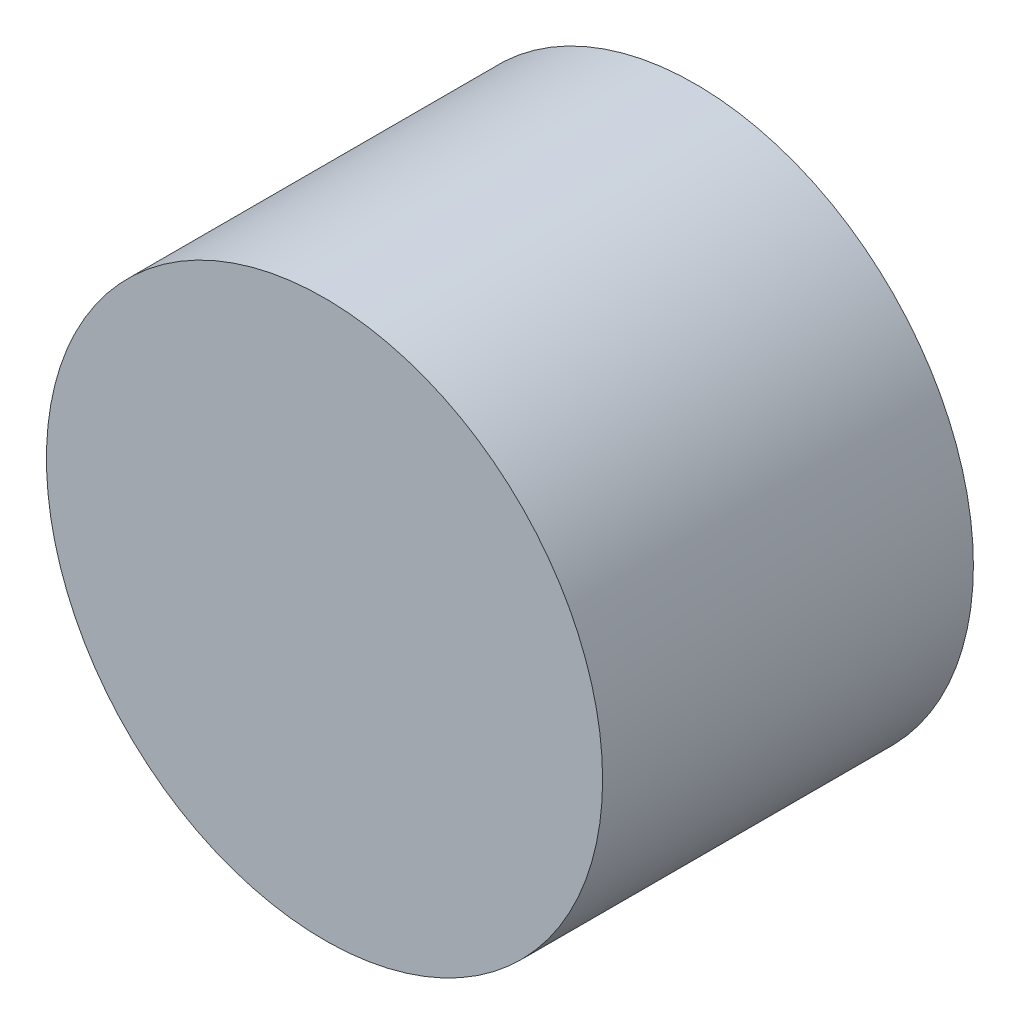
ISO-10303-21;
HEADER;
FILE_DESCRIPTION(('STEP AP214'),'2;1');
FILE_NAME('part.step','',(''),(''),'','','');
FILE_SCHEMA(('AUTOMOTIVE_DESIGN { 1 0 10303 214 1 1 1 1 }'));
ENDSEC;
DATA;
#1=APPLICATION_CONTEXT('core data for automotive mechanical design processes');
#2=APPLICATION_PROTOCOL_DEFINITION('international standard','automotive_design',2000,#1);
#3=PRODUCT_CONTEXT('',#1,'mechanical');
#4=PRODUCT('Part','Part','',(#3));
#5=PRODUCT_RELATED_PRODUCT_CATEGORY('part','',(#4));
#6=PRODUCT_DEFINITION_FORMATION('','',#4);
#7=PRODUCT_DEFINITION_CONTEXT('part definition',#1,'design');
#8=PRODUCT_DEFINITION('design','',#6,#7);
#9=PRODUCT_DEFINITION_SHAPE('','',#8);
#10=(LENGTH_UNIT() NAMED_UNIT(*) SI_UNIT(.MILLI.,.METRE.));
#11=(NAMED_UNIT(*) PLANE_ANGLE_UNIT() SI_UNIT($,.RADIAN.));
#12=(NAMED_UNIT(*) SI_UNIT($,.STERADIAN.) SOLID_ANGLE_UNIT());
#13=UNCERTAINTY_MEASURE_WITH_UNIT(LENGTH_MEASURE(1.E-05),#10,'distance_accuracy_value','');
#14=(GEOMETRIC_REPRESENTATION_CONTEXT(3) GLOBAL_UNCERTAINTY_ASSIGNED_CONTEXT((#13)) GLOBAL_UNIT_ASSIGNED_CONTEXT((#10,
#11,#12)) REPRESENTATION_CONTEXT('',''));
#15=CARTESIAN_POINT('',(0.,0.,0.));
#16=DIRECTION('',(0.,0.,1.));
#17=DIRECTION('',(1.,0.,0.));
#18=AXIS2_PLACEMENT_3D('',#15,#16,#17);
#19=CARTESIAN_POINT('',(0.,0.,16.));
#20=DIRECTION('',(0.,0.,-1.));
#21=DIRECTION('',(-1.,0.,0.));
#22=AXIS2_PLACEMENT_3D('',#19,#20,#21);
#23=CYLINDRICAL_SURFACE('',#22,12.);
#24=CARTESIAN_POINT('',(0.,0.,0.));
#25=DIRECTION('',(0.,0.,1.));
#26=DIRECTION('',(1.,0.,0.));
#27=AXIS2_PLACEMENT_3D('',#24,#25,#26);
#28=CIRCLE('',#27,12.);
#29=CARTESIAN_POINT('',(12.,0.,0.));
#30=VERTEX_POINT('',#29);
#31=EDGE_CURVE('E86',#30,#30,#28,.T.);
#32=ORIENTED_EDGE('',*,*,#31,.T.);
#33=EDGE_LOOP('',(#32));
#34=FACE_BOUND('',#33,.T.);
#35=CARTESIAN_POINT('',(0.,0.,16.));
#36=DIRECTION('',(0.,0.,1.));
#37=DIRECTION('',(1.,0.,0.));
#38=AXIS2_PLACEMENT_3D('',#35,#36,#37);
#39=CIRCLE('',#38,12.);
#40=CARTESIAN_POINT('',(12.,0.,16.));
#41=VERTEX_POINT('',#40);
#42=EDGE_CURVE('E108',#41,#41,#39,.T.);
#43=ORIENTED_EDGE('',*,*,#42,.F.);
#44=EDGE_LOOP('',(#43));
#45=FACE_BOUND('',#44,.T.);
#46=CARTESIAN_POINT('',(0.,0.,7.));
#47=DIRECTION('',(0.,0.,-1.));
#48=DIRECTION('',(-1.,0.,0.));
#49=AXIS2_PLACEMENT_3D('',#46,#47,#48);
#50=CIRCLE('',#49,12.);
#51=CARTESIAN_POINT('',(-10.3923048454133,-6.,7.));
#52=VERTEX_POINT('',#51);
#53=CARTESIAN_POINT('',(-10.3923048454133,6.,7.));
#54=VERTEX_POINT('',#53);
#55=EDGE_CURVE('E11',#52,#54,#50,.T.);
#56=ORIENTED_EDGE('',*,*,#55,.F.);
#57=DIRECTION('',(0.,0.,-1.));
#58=VECTOR('',#57,1.);
#59=CARTESIAN_POINT('',(-10.3923048454133,-6.,16.));
#60=LINE('',#59,#58);
#61=CARTESIAN_POINT('',(-10.3923048454133,-6.,1.));
#62=VERTEX_POINT('',#61);
#63=EDGE_CURVE('E111',#62,#52,#60,.F.);
#64=ORIENTED_EDGE('',*,*,#63,.F.);
#65=CARTESIAN_POINT('',(0.,0.,1.));
#66=DIRECTION('',(0.,0.,1.));
#67=DIRECTION('',(1.,0.,0.));
#68=AXIS2_PLACEMENT_3D('',#65,#66,#67);
#69=CIRCLE('',#68,12.);
#70=CARTESIAN_POINT('',(-10.3923048454133,6.,1.));
#71=VERTEX_POINT('',#70);
#72=EDGE_CURVE('E115',#71,#62,#69,.T.);
#73=ORIENTED_EDGE('',*,*,#72,.F.);
#74=DIRECTION('',(0.,0.,-1.));
#75=VECTOR('',#74,1.);
#76=CARTESIAN_POINT('',(-10.3923048454133,6.,16.));
#77=LINE('',#76,#75);
#78=EDGE_CURVE('E48',#54,#71,#77,.T.);
#79=ORIENTED_EDGE('',*,*,#78,.F.);
#80=EDGE_LOOP('',(#56,#64,#73,#79));
#81=FACE_BOUND('',#80,.T.);
#82=ADVANCED_FACE('F41',(#34,#45,#81),#23,.T.);
#83=CARTESIAN_POINT('',(0.,0.,16.));
#84=DIRECTION('',(0.,0.,1.));
#85=DIRECTION('',(1.,0.,0.));
#86=AXIS2_PLACEMENT_3D('',#83,#84,#85);
#87=PLANE('',#86);
#88=ORIENTED_EDGE('',*,*,#42,.T.);
#89=EDGE_LOOP('',(#88));
#90=FACE_BOUND('',#89,.T.);
#91=ADVANCED_FACE('F131',(#90),#87,.T.);
#92=CARTESIAN_POINT('',(0.,0.,0.));
#93=DIRECTION('',(0.,0.,1.));
#94=DIRECTION('',(1.,0.,0.));
#95=AXIS2_PLACEMENT_3D('',#92,#93,#94);
#96=PLANE('',#95);
#97=ORIENTED_EDGE('',*,*,#31,.F.);
#98=EDGE_LOOP('',(#97));
#99=FACE_BOUND('',#98,.T.);
#100=ADVANCED_FACE('F138',(#99),#96,.F.);
#101=CARTESIAN_POINT('',(-13.,-6.,7.));
#102=DIRECTION('',(0.,0.,-1.));
#103=DIRECTION('',(-1.,0.,0.));
#104=AXIS2_PLACEMENT_3D('',#101,#102,#103);
#105=PLANE('',#104);
#106=ORIENTED_EDGE('',*,*,#55,.T.);
#107=DIRECTION('',(1.,0.,0.));
#108=VECTOR('',#107,1.);
#109=CARTESIAN_POINT('',(-13.,6.,7.));
#110=LINE('',#109,#108);
#111=CARTESIAN_POINT('',(-3.00000000000001,6.,7.));
#112=VERTEX_POINT('',#111);
#113=EDGE_CURVE('E78',#54,#112,#110,.T.);
#114=ORIENTED_EDGE('',*,*,#113,.T.);
#115=DIRECTION('',(0.,1.,0.));
#116=VECTOR('',#115,1.);
#117=CARTESIAN_POINT('',(-3.00000000000001,-6.,7.));
#118=LINE('',#117,#116);
#119=CARTESIAN_POINT('',(-3.00000000000001,-6.,7.));
#120=VERTEX_POINT('',#119);
#121=EDGE_CURVE('E82',#120,#112,#118,.T.);
#122=ORIENTED_EDGE('',*,*,#121,.F.);
#123=DIRECTION('',(1.,0.,0.));
#124=VECTOR('',#123,1.);
#125=CARTESIAN_POINT('',(-13.,-6.,7.));
#126=LINE('',#125,#124);
#127=EDGE_CURVE('E104',#52,#120,#126,.T.);
#128=ORIENTED_EDGE('',*,*,#127,.F.);
#129=EDGE_LOOP('',(#106,#114,#122,#128));
#130=FACE_BOUND('',#129,.T.);
#131=ADVANCED_FACE('F80',(#130),#105,.T.);
#132=CARTESIAN_POINT('',(-13.,6.,1.));
#133=DIRECTION('',(0.,-1.,0.));
#134=DIRECTION('',(0.,0.,-1.));
#135=AXIS2_PLACEMENT_3D('',#132,#133,#134);
#136=PLANE('',#135);
#137=ORIENTED_EDGE('',*,*,#78,.T.);
#138=DIRECTION('',(1.,0.,0.));
#139=VECTOR('',#138,1.);
#140=CARTESIAN_POINT('',(-13.,6.,1.));
#141=LINE('',#140,#139);
#142=CARTESIAN_POINT('',(-3.00000000000001,6.,1.));
#143=VERTEX_POINT('',#142);
#144=EDGE_CURVE('E87',#71,#143,#141,.T.);
#145=ORIENTED_EDGE('',*,*,#144,.T.);
#146=DIRECTION('',(0.,0.,-1.));
#147=VECTOR('',#146,1.);
#148=CARTESIAN_POINT('',(-3.00000000000001,6.,1.));
#149=LINE('',#148,#147);
#150=EDGE_CURVE('E90',#112,#143,#149,.T.);
#151=ORIENTED_EDGE('',*,*,#150,.F.);
#152=ORIENTED_EDGE('',*,*,#113,.F.);
#153=EDGE_LOOP('',(#137,#145,#151,#152));
#154=FACE_BOUND('',#153,.T.);
#155=ADVANCED_FACE('F91',(#154),#136,.T.);
#156=CARTESIAN_POINT('',(-13.,-6.,1.));
#157=DIRECTION('',(0.,0.,1.));
#158=DIRECTION('',(1.,0.,0.));
#159=AXIS2_PLACEMENT_3D('',#156,#157,#158);
#160=PLANE('',#159);
#161=ORIENTED_EDGE('',*,*,#72,.T.);
#162=DIRECTION('',(1.,0.,0.));
#163=VECTOR('',#162,1.);
#164=CARTESIAN_POINT('',(-13.,-6.,1.));
#165=LINE('',#164,#163);
#166=CARTESIAN_POINT('',(-3.00000000000001,-6.,1.));
#167=VERTEX_POINT('',#166);
#168=EDGE_CURVE('E55',#62,#167,#165,.T.);
#169=ORIENTED_EDGE('',*,*,#168,.T.);
#170=DIRECTION('',(0.,-1.,0.));
#171=VECTOR('',#170,1.);
#172=CARTESIAN_POINT('',(-3.00000000000001,-6.,1.));
#173=LINE('',#172,#171);
#174=EDGE_CURVE('E96',#143,#167,#173,.T.);
#175=ORIENTED_EDGE('',*,*,#174,.F.);
#176=ORIENTED_EDGE('',*,*,#144,.F.);
#177=EDGE_LOOP('',(#161,#169,#175,#176));
#178=FACE_BOUND('',#177,.T.);
#179=ADVANCED_FACE('F119',(#178),#160,.T.);
#180=CARTESIAN_POINT('',(-13.,-6.,1.));
#181=DIRECTION('',(0.,1.,0.));
#182=DIRECTION('',(0.,0.,1.));
#183=AXIS2_PLACEMENT_3D('',#180,#181,#182);
#184=PLANE('',#183);
#185=ORIENTED_EDGE('',*,*,#63,.T.);
#186=ORIENTED_EDGE('',*,*,#127,.T.);
#187=DIRECTION('',(0.,0.,1.));
#188=VECTOR('',#187,1.);
#189=CARTESIAN_POINT('',(-3.00000000000001,-6.,1.));
#190=LINE('',#189,#188);
#191=EDGE_CURVE('E99',#167,#120,#190,.T.);
#192=ORIENTED_EDGE('',*,*,#191,.F.);
#193=ORIENTED_EDGE('',*,*,#168,.F.);
#194=EDGE_LOOP('',(#185,#186,#192,#193));
#195=FACE_BOUND('',#194,.T.);
#196=ADVANCED_FACE('F121',(#195),#184,.T.);
#197=CARTESIAN_POINT('',(-3.00000000000001,0.,0.));
#198=DIRECTION('',(1.,0.,0.));
#199=DIRECTION('',(0.,0.,-1.));
#200=AXIS2_PLACEMENT_3D('',#197,#198,#199);
#201=PLANE('',#200);
#202=ORIENTED_EDGE('',*,*,#121,.T.);
#203=ORIENTED_EDGE('',*,*,#150,.T.);
#204=ORIENTED_EDGE('',*,*,#174,.T.);
#205=ORIENTED_EDGE('',*,*,#191,.T.);
#206=EDGE_LOOP('',(#202,#203,#204,#205));
#207=FACE_BOUND('',#206,.T.);
#208=ADVANCED_FACE('F98',(#207),#201,.F.);
#209=CLOSED_SHELL('',(#82,#91,#100,#131,#155,#179,#196,#208));
#210=MANIFOLD_SOLID_BREP('B2',#209);
#211=ADVANCED_BREP_SHAPE_REPRESENTATION('',(#18,#210),#14);
#212=SHAPE_DEFINITION_REPRESENTATION(#9,#211);
ENDSEC;
END-ISO-10303-21;
